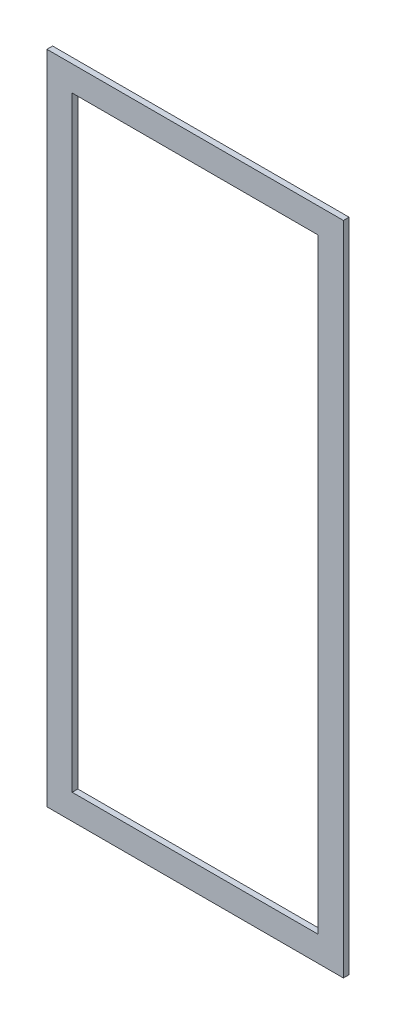
ISO-10303-21;
HEADER;
FILE_DESCRIPTION(('STEP AP214'),'2;1');
FILE_NAME('part.step','',(''),(''),'','','');
FILE_SCHEMA(('AUTOMOTIVE_DESIGN { 1 0 10303 214 1 1 1 1 }'));
ENDSEC;
DATA;
#1=APPLICATION_CONTEXT('core data for automotive mechanical design processes');
#2=APPLICATION_PROTOCOL_DEFINITION('international standard','automotive_design',2000,#1);
#3=PRODUCT_CONTEXT('',#1,'mechanical');
#4=PRODUCT('Part','Part','',(#3));
#5=PRODUCT_RELATED_PRODUCT_CATEGORY('part','',(#4));
#6=PRODUCT_DEFINITION_FORMATION('','',#4);
#7=PRODUCT_DEFINITION_CONTEXT('part definition',#1,'design');
#8=PRODUCT_DEFINITION('design','',#6,#7);
#9=PRODUCT_DEFINITION_SHAPE('','',#8);
#10=(LENGTH_UNIT() NAMED_UNIT(*) SI_UNIT(.MILLI.,.METRE.));
#11=(NAMED_UNIT(*) PLANE_ANGLE_UNIT() SI_UNIT($,.RADIAN.));
#12=(NAMED_UNIT(*) SI_UNIT($,.STERADIAN.) SOLID_ANGLE_UNIT());
#13=UNCERTAINTY_MEASURE_WITH_UNIT(LENGTH_MEASURE(1.E-05),#10,'distance_accuracy_value','');
#14=(GEOMETRIC_REPRESENTATION_CONTEXT(3) GLOBAL_UNCERTAINTY_ASSIGNED_CONTEXT((#13)) GLOBAL_UNIT_ASSIGNED_CONTEXT((#10,
#11,#12)) REPRESENTATION_CONTEXT('',''));
#15=CARTESIAN_POINT('',(0.,0.,0.));
#16=DIRECTION('',(0.,0.,1.));
#17=DIRECTION('',(1.,0.,0.));
#18=AXIS2_PLACEMENT_3D('',#15,#16,#17);
#19=CARTESIAN_POINT('',(47.,104.,1.8));
#20=DIRECTION('',(0.,0.,-1.));
#21=DIRECTION('',(-1.,0.,0.));
#22=AXIS2_PLACEMENT_3D('',#19,#20,#21);
#23=PLANE('',#22);
#24=DIRECTION('',(0.,1.,0.));
#25=VECTOR('',#24,1.);
#26=CARTESIAN_POINT('',(47.,-104.,1.8));
#27=LINE('',#26,#25);
#28=CARTESIAN_POINT('',(47.,-104.,1.8));
#29=VERTEX_POINT('',#28);
#30=CARTESIAN_POINT('',(47.,104.,1.8));
#31=VERTEX_POINT('',#30);
#32=EDGE_CURVE('E132',#29,#31,#27,.T.);
#33=ORIENTED_EDGE('',*,*,#32,.T.);
#34=DIRECTION('',(-1.,0.,0.));
#35=VECTOR('',#34,1.);
#36=CARTESIAN_POINT('',(-47.,104.,1.8));
#37=LINE('',#36,#35);
#38=CARTESIAN_POINT('',(-47.,104.,1.8));
#39=VERTEX_POINT('',#38);
#40=EDGE_CURVE('E135',#31,#39,#37,.T.);
#41=ORIENTED_EDGE('',*,*,#40,.T.);
#42=DIRECTION('',(0.,-1.,0.));
#43=VECTOR('',#42,1.);
#44=CARTESIAN_POINT('',(-47.,-104.,1.8));
#45=LINE('',#44,#43);
#46=CARTESIAN_POINT('',(-47.,-104.,1.8));
#47=VERTEX_POINT('',#46);
#48=EDGE_CURVE('E138',#39,#47,#45,.T.);
#49=ORIENTED_EDGE('',*,*,#48,.T.);
#50=DIRECTION('',(1.,0.,0.));
#51=VECTOR('',#50,1.);
#52=CARTESIAN_POINT('',(-47.,-104.,1.8));
#53=LINE('',#52,#51);
#54=EDGE_CURVE('E140',#47,#29,#53,.T.);
#55=ORIENTED_EDGE('',*,*,#54,.T.);
#56=EDGE_LOOP('',(#33,#41,#49,#55));
#57=FACE_BOUND('',#56,.T.);
#58=DIRECTION('',(0.,1.,0.));
#59=VECTOR('',#58,1.);
#60=CARTESIAN_POINT('',(39.,-96.,1.8));
#61=LINE('',#60,#59);
#62=CARTESIAN_POINT('',(39.,-96.,1.8));
#63=VERTEX_POINT('',#62);
#64=CARTESIAN_POINT('',(39.,96.,1.8));
#65=VERTEX_POINT('',#64);
#66=EDGE_CURVE('E96',#63,#65,#61,.T.);
#67=ORIENTED_EDGE('',*,*,#66,.F.);
#68=DIRECTION('',(1.,0.,0.));
#69=VECTOR('',#68,1.);
#70=CARTESIAN_POINT('',(-39.,-96.,1.8));
#71=LINE('',#70,#69);
#72=CARTESIAN_POINT('',(-39.,-96.,1.8));
#73=VERTEX_POINT('',#72);
#74=EDGE_CURVE('E118',#73,#63,#71,.T.);
#75=ORIENTED_EDGE('',*,*,#74,.F.);
#76=DIRECTION('',(0.,-1.,0.));
#77=VECTOR('',#76,1.);
#78=CARTESIAN_POINT('',(-39.,-96.,1.8));
#79=LINE('',#78,#77);
#80=CARTESIAN_POINT('',(-39.,96.,1.8));
#81=VERTEX_POINT('',#80);
#82=EDGE_CURVE('E116',#81,#73,#79,.T.);
#83=ORIENTED_EDGE('',*,*,#82,.F.);
#84=DIRECTION('',(-1.,0.,0.));
#85=VECTOR('',#84,1.);
#86=CARTESIAN_POINT('',(-39.,96.,1.8));
#87=LINE('',#86,#85);
#88=EDGE_CURVE('E104',#65,#81,#87,.T.);
#89=ORIENTED_EDGE('',*,*,#88,.F.);
#90=EDGE_LOOP('',(#67,#75,#83,#89));
#91=FACE_BOUND('',#90,.T.);
#92=ADVANCED_FACE('F31',(#57,#91),#23,.F.);
#93=CARTESIAN_POINT('',(47.,104.,0.));
#94=DIRECTION('',(0.,0.,-1.));
#95=DIRECTION('',(-1.,0.,0.));
#96=AXIS2_PLACEMENT_3D('',#93,#94,#95);
#97=PLANE('',#96);
#98=DIRECTION('',(0.,1.,0.));
#99=VECTOR('',#98,1.);
#100=CARTESIAN_POINT('',(47.,-104.,0.));
#101=LINE('',#100,#99);
#102=CARTESIAN_POINT('',(47.,-104.,0.));
#103=VERTEX_POINT('',#102);
#104=CARTESIAN_POINT('',(47.,104.,0.));
#105=VERTEX_POINT('',#104);
#106=EDGE_CURVE('E112',#103,#105,#101,.T.);
#107=ORIENTED_EDGE('',*,*,#106,.F.);
#108=DIRECTION('',(1.,0.,0.));
#109=VECTOR('',#108,1.);
#110=CARTESIAN_POINT('',(-47.,-104.,0.));
#111=LINE('',#110,#109);
#112=CARTESIAN_POINT('',(-47.,-104.,0.));
#113=VERTEX_POINT('',#112);
#114=EDGE_CURVE('E136',#113,#103,#111,.T.);
#115=ORIENTED_EDGE('',*,*,#114,.F.);
#116=DIRECTION('',(0.,-1.,0.));
#117=VECTOR('',#116,1.);
#118=CARTESIAN_POINT('',(-47.,-104.,0.));
#119=LINE('',#118,#117);
#120=CARTESIAN_POINT('',(-47.,104.,0.));
#121=VERTEX_POINT('',#120);
#122=EDGE_CURVE('E147',#121,#113,#119,.T.);
#123=ORIENTED_EDGE('',*,*,#122,.F.);
#124=DIRECTION('',(-1.,0.,0.));
#125=VECTOR('',#124,1.);
#126=CARTESIAN_POINT('',(-47.,104.,0.));
#127=LINE('',#126,#125);
#128=EDGE_CURVE('E145',#105,#121,#127,.T.);
#129=ORIENTED_EDGE('',*,*,#128,.F.);
#130=EDGE_LOOP('',(#107,#115,#123,#129));
#131=FACE_BOUND('',#130,.T.);
#132=DIRECTION('',(1.,0.,0.));
#133=VECTOR('',#132,1.);
#134=CARTESIAN_POINT('',(-39.,-96.,0.));
#135=LINE('',#134,#133);
#136=CARTESIAN_POINT('',(-39.,-96.,0.));
#137=VERTEX_POINT('',#136);
#138=CARTESIAN_POINT('',(39.,-96.,0.));
#139=VERTEX_POINT('',#138);
#140=EDGE_CURVE('E105',#137,#139,#135,.T.);
#141=ORIENTED_EDGE('',*,*,#140,.T.);
#142=DIRECTION('',(0.,1.,0.));
#143=VECTOR('',#142,1.);
#144=CARTESIAN_POINT('',(39.,-96.,0.));
#145=LINE('',#144,#143);
#146=CARTESIAN_POINT('',(39.,96.,0.));
#147=VERTEX_POINT('',#146);
#148=EDGE_CURVE('E54',#139,#147,#145,.T.);
#149=ORIENTED_EDGE('',*,*,#148,.T.);
#150=DIRECTION('',(-1.,0.,0.));
#151=VECTOR('',#150,1.);
#152=CARTESIAN_POINT('',(-39.,96.,0.));
#153=LINE('',#152,#151);
#154=CARTESIAN_POINT('',(-39.,96.,0.));
#155=VERTEX_POINT('',#154);
#156=EDGE_CURVE('E111',#147,#155,#153,.T.);
#157=ORIENTED_EDGE('',*,*,#156,.T.);
#158=DIRECTION('',(0.,-1.,0.));
#159=VECTOR('',#158,1.);
#160=CARTESIAN_POINT('',(-39.,-96.,0.));
#161=LINE('',#160,#159);
#162=EDGE_CURVE('E124',#155,#137,#161,.T.);
#163=ORIENTED_EDGE('',*,*,#162,.T.);
#164=EDGE_LOOP('',(#141,#149,#157,#163));
#165=FACE_BOUND('',#164,.T.);
#166=ADVANCED_FACE('F165',(#131,#165),#97,.T.);
#167=CARTESIAN_POINT('',(47.,-104.,1.8));
#168=DIRECTION('',(-1.,0.,0.));
#169=DIRECTION('',(0.,0.,1.));
#170=AXIS2_PLACEMENT_3D('',#167,#168,#169);
#171=PLANE('',#170);
#172=ORIENTED_EDGE('',*,*,#106,.T.);
#173=DIRECTION('',(0.,0.,-1.));
#174=VECTOR('',#173,1.);
#175=CARTESIAN_POINT('',(47.,104.,1.8));
#176=LINE('',#175,#174);
#177=EDGE_CURVE('E11',#31,#105,#176,.T.);
#178=ORIENTED_EDGE('',*,*,#177,.F.);
#179=ORIENTED_EDGE('',*,*,#32,.F.);
#180=DIRECTION('',(0.,0.,-1.));
#181=VECTOR('',#180,1.);
#182=CARTESIAN_POINT('',(47.,-104.,1.8));
#183=LINE('',#182,#181);
#184=EDGE_CURVE('E142',#29,#103,#183,.T.);
#185=ORIENTED_EDGE('',*,*,#184,.T.);
#186=EDGE_LOOP('',(#172,#178,#179,#185));
#187=FACE_BOUND('',#186,.T.);
#188=ADVANCED_FACE('F33',(#187),#171,.F.);
#189=CARTESIAN_POINT('',(-47.,104.,1.8));
#190=DIRECTION('',(0.,-1.,0.));
#191=DIRECTION('',(0.,0.,-1.));
#192=AXIS2_PLACEMENT_3D('',#189,#190,#191);
#193=PLANE('',#192);
#194=ORIENTED_EDGE('',*,*,#128,.T.);
#195=DIRECTION('',(0.,0.,-1.));
#196=VECTOR('',#195,1.);
#197=CARTESIAN_POINT('',(-47.,104.,1.8));
#198=LINE('',#197,#196);
#199=EDGE_CURVE('E39',#39,#121,#198,.T.);
#200=ORIENTED_EDGE('',*,*,#199,.F.);
#201=ORIENTED_EDGE('',*,*,#40,.F.);
#202=ORIENTED_EDGE('',*,*,#177,.T.);
#203=EDGE_LOOP('',(#194,#200,#201,#202));
#204=FACE_BOUND('',#203,.T.);
#205=ADVANCED_FACE('F175',(#204),#193,.F.);
#206=CARTESIAN_POINT('',(-47.,-104.,1.8));
#207=DIRECTION('',(1.,0.,0.));
#208=DIRECTION('',(0.,0.,-1.));
#209=AXIS2_PLACEMENT_3D('',#206,#207,#208);
#210=PLANE('',#209);
#211=ORIENTED_EDGE('',*,*,#122,.T.);
#212=DIRECTION('',(0.,0.,-1.));
#213=VECTOR('',#212,1.);
#214=CARTESIAN_POINT('',(-47.,-104.,1.8));
#215=LINE('',#214,#213);
#216=EDGE_CURVE('E152',#47,#113,#215,.T.);
#217=ORIENTED_EDGE('',*,*,#216,.F.);
#218=ORIENTED_EDGE('',*,*,#48,.F.);
#219=ORIENTED_EDGE('',*,*,#199,.T.);
#220=EDGE_LOOP('',(#211,#217,#218,#219));
#221=FACE_BOUND('',#220,.T.);
#222=ADVANCED_FACE('F159',(#221),#210,.F.);
#223=CARTESIAN_POINT('',(-47.,-104.,1.8));
#224=DIRECTION('',(0.,1.,0.));
#225=DIRECTION('',(0.,0.,1.));
#226=AXIS2_PLACEMENT_3D('',#223,#224,#225);
#227=PLANE('',#226);
#228=ORIENTED_EDGE('',*,*,#114,.T.);
#229=ORIENTED_EDGE('',*,*,#184,.F.);
#230=ORIENTED_EDGE('',*,*,#54,.F.);
#231=ORIENTED_EDGE('',*,*,#216,.T.);
#232=EDGE_LOOP('',(#228,#229,#230,#231));
#233=FACE_BOUND('',#232,.T.);
#234=ADVANCED_FACE('F169',(#233),#227,.F.);
#235=CARTESIAN_POINT('',(39.,-96.,1.8));
#236=DIRECTION('',(-1.,0.,0.));
#237=DIRECTION('',(0.,0.,1.));
#238=AXIS2_PLACEMENT_3D('',#235,#236,#237);
#239=PLANE('',#238);
#240=ORIENTED_EDGE('',*,*,#148,.F.);
#241=DIRECTION('',(0.,0.,-1.));
#242=VECTOR('',#241,1.);
#243=CARTESIAN_POINT('',(39.,-96.,1.8));
#244=LINE('',#243,#242);
#245=EDGE_CURVE('E100',#63,#139,#244,.T.);
#246=ORIENTED_EDGE('',*,*,#245,.F.);
#247=ORIENTED_EDGE('',*,*,#66,.T.);
#248=DIRECTION('',(0.,0.,-1.));
#249=VECTOR('',#248,1.);
#250=CARTESIAN_POINT('',(39.,96.,1.8));
#251=LINE('',#250,#249);
#252=EDGE_CURVE('E99',#65,#147,#251,.T.);
#253=ORIENTED_EDGE('',*,*,#252,.T.);
#254=EDGE_LOOP('',(#240,#246,#247,#253));
#255=FACE_BOUND('',#254,.T.);
#256=ADVANCED_FACE('F98',(#255),#239,.T.);
#257=CARTESIAN_POINT('',(-39.,96.,1.8));
#258=DIRECTION('',(0.,-1.,0.));
#259=DIRECTION('',(0.,0.,-1.));
#260=AXIS2_PLACEMENT_3D('',#257,#258,#259);
#261=PLANE('',#260);
#262=ORIENTED_EDGE('',*,*,#156,.F.);
#263=ORIENTED_EDGE('',*,*,#252,.F.);
#264=ORIENTED_EDGE('',*,*,#88,.T.);
#265=DIRECTION('',(0.,0.,-1.));
#266=VECTOR('',#265,1.);
#267=CARTESIAN_POINT('',(-39.,96.,1.8));
#268=LINE('',#267,#266);
#269=EDGE_CURVE('E113',#81,#155,#268,.T.);
#270=ORIENTED_EDGE('',*,*,#269,.T.);
#271=EDGE_LOOP('',(#262,#263,#264,#270));
#272=FACE_BOUND('',#271,.T.);
#273=ADVANCED_FACE('F108',(#272),#261,.T.);
#274=CARTESIAN_POINT('',(-39.,-96.,1.8));
#275=DIRECTION('',(1.,0.,0.));
#276=DIRECTION('',(0.,0.,-1.));
#277=AXIS2_PLACEMENT_3D('',#274,#275,#276);
#278=PLANE('',#277);
#279=ORIENTED_EDGE('',*,*,#162,.F.);
#280=ORIENTED_EDGE('',*,*,#269,.F.);
#281=ORIENTED_EDGE('',*,*,#82,.T.);
#282=DIRECTION('',(0.,0.,-1.));
#283=VECTOR('',#282,1.);
#284=CARTESIAN_POINT('',(-39.,-96.,1.8));
#285=LINE('',#284,#283);
#286=EDGE_CURVE('E46',#73,#137,#285,.T.);
#287=ORIENTED_EDGE('',*,*,#286,.T.);
#288=EDGE_LOOP('',(#279,#280,#281,#287));
#289=FACE_BOUND('',#288,.T.);
#290=ADVANCED_FACE('F198',(#289),#278,.T.);
#291=CARTESIAN_POINT('',(-39.,-96.,1.8));
#292=DIRECTION('',(0.,1.,0.));
#293=DIRECTION('',(0.,0.,1.));
#294=AXIS2_PLACEMENT_3D('',#291,#292,#293);
#295=PLANE('',#294);
#296=ORIENTED_EDGE('',*,*,#140,.F.);
#297=ORIENTED_EDGE('',*,*,#286,.F.);
#298=ORIENTED_EDGE('',*,*,#74,.T.);
#299=ORIENTED_EDGE('',*,*,#245,.T.);
#300=EDGE_LOOP('',(#296,#297,#298,#299));
#301=FACE_BOUND('',#300,.T.);
#302=ADVANCED_FACE('F202',(#301),#295,.T.);
#303=CLOSED_SHELL('',(#92,#166,#188,#205,#222,#234,#256,#273,#290,#302));
#304=MANIFOLD_SOLID_BREP('B2',#303);
#305=ADVANCED_BREP_SHAPE_REPRESENTATION('',(#18,#304),#14);
#306=SHAPE_DEFINITION_REPRESENTATION(#9,#305);
ENDSEC;
END-ISO-10303-21;
